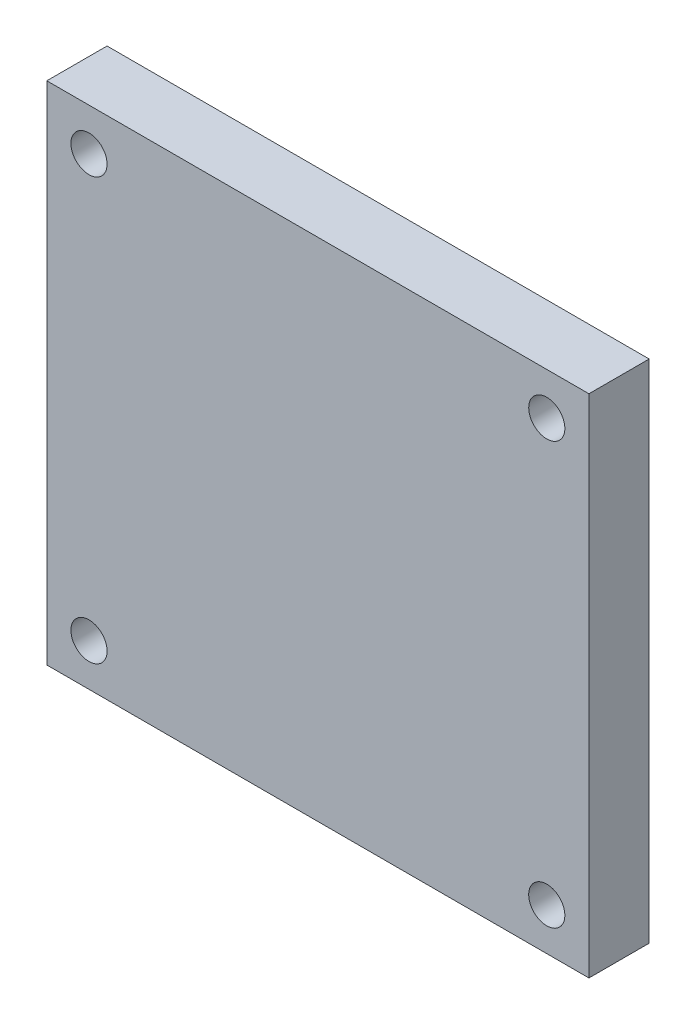
ISO-10303-21;
HEADER;
FILE_DESCRIPTION(('STEP AP214'),'2;1');
FILE_NAME('part.step','',(''),(''),'','','');
FILE_SCHEMA(('AUTOMOTIVE_DESIGN { 1 0 10303 214 1 1 1 1 }'));
ENDSEC;
DATA;
#1=APPLICATION_CONTEXT('core data for automotive mechanical design processes');
#2=APPLICATION_PROTOCOL_DEFINITION('international standard','automotive_design',2000,#1);
#3=PRODUCT_CONTEXT('',#1,'mechanical');
#4=PRODUCT('Part','Part','',(#3));
#5=PRODUCT_RELATED_PRODUCT_CATEGORY('part','',(#4));
#6=PRODUCT_DEFINITION_FORMATION('','',#4);
#7=PRODUCT_DEFINITION_CONTEXT('part definition',#1,'design');
#8=PRODUCT_DEFINITION('design','',#6,#7);
#9=PRODUCT_DEFINITION_SHAPE('','',#8);
#10=(LENGTH_UNIT() NAMED_UNIT(*) SI_UNIT(.MILLI.,.METRE.));
#11=(NAMED_UNIT(*) PLANE_ANGLE_UNIT() SI_UNIT($,.RADIAN.));
#12=(NAMED_UNIT(*) SI_UNIT($,.STERADIAN.) SOLID_ANGLE_UNIT());
#13=UNCERTAINTY_MEASURE_WITH_UNIT(LENGTH_MEASURE(1.E-05),#10,'distance_accuracy_value','');
#14=(GEOMETRIC_REPRESENTATION_CONTEXT(3) GLOBAL_UNCERTAINTY_ASSIGNED_CONTEXT((#13)) GLOBAL_UNIT_ASSIGNED_CONTEXT((#10,
#11,#12)) REPRESENTATION_CONTEXT('',''));
#15=CARTESIAN_POINT('',(0.,0.,0.));
#16=DIRECTION('',(0.,0.,1.));
#17=DIRECTION('',(1.,0.,0.));
#18=AXIS2_PLACEMENT_3D('',#15,#16,#17);
#19=CARTESIAN_POINT('',(0.,0.,5.));
#20=DIRECTION('',(0.,0.,1.));
#21=DIRECTION('',(1.,0.,0.));
#22=AXIS2_PLACEMENT_3D('',#19,#20,#21);
#23=PLANE('',#22);
#24=CARTESIAN_POINT('',(-3.5,38.5,5.));
#25=DIRECTION('',(0.,0.,1.));
#26=DIRECTION('',(-1.,0.,0.));
#27=AXIS2_PLACEMENT_3D('',#24,#25,#26);
#28=CIRCLE('',#27,1.5);
#29=CARTESIAN_POINT('',(-5.,38.5,5.));
#30=VERTEX_POINT('',#29);
#31=EDGE_CURVE('E146',#30,#30,#28,.T.);
#32=ORIENTED_EDGE('',*,*,#31,.F.);
#33=EDGE_LOOP('',(#32));
#34=FACE_BOUND('',#33,.T.);
#35=CARTESIAN_POINT('',(-3.5,3.5,5.));
#36=DIRECTION('',(0.,0.,1.));
#37=DIRECTION('',(1.,0.,0.));
#38=AXIS2_PLACEMENT_3D('',#35,#36,#37);
#39=CIRCLE('',#38,1.5);
#40=CARTESIAN_POINT('',(-2.,3.5,5.));
#41=VERTEX_POINT('',#40);
#42=EDGE_CURVE('E116',#41,#41,#39,.T.);
#43=ORIENTED_EDGE('',*,*,#42,.F.);
#44=EDGE_LOOP('',(#43));
#45=FACE_BOUND('',#44,.T.);
#46=DIRECTION('',(0.,1.,0.));
#47=VECTOR('',#46,1.);
#48=CARTESIAN_POINT('',(0.,0.,5.));
#49=LINE('',#48,#47);
#50=CARTESIAN_POINT('',(0.,0.,5.));
#51=VERTEX_POINT('',#50);
#52=CARTESIAN_POINT('',(0.,42.,5.));
#53=VERTEX_POINT('',#52);
#54=EDGE_CURVE('E96',#51,#53,#49,.T.);
#55=ORIENTED_EDGE('',*,*,#54,.T.);
#56=DIRECTION('',(-1.,0.,0.));
#57=VECTOR('',#56,1.);
#58=CARTESIAN_POINT('',(0.,42.,5.));
#59=LINE('',#58,#57);
#60=CARTESIAN_POINT('',(-45.,42.,5.));
#61=VERTEX_POINT('',#60);
#62=EDGE_CURVE('E91',#53,#61,#59,.T.);
#63=ORIENTED_EDGE('',*,*,#62,.T.);
#64=DIRECTION('',(0.,-1.,0.));
#65=VECTOR('',#64,1.);
#66=CARTESIAN_POINT('',(-45.,0.,5.));
#67=LINE('',#66,#65);
#68=CARTESIAN_POINT('',(-45.,0.,5.));
#69=VERTEX_POINT('',#68);
#70=EDGE_CURVE('E94',#61,#69,#67,.T.);
#71=ORIENTED_EDGE('',*,*,#70,.T.);
#72=DIRECTION('',(1.,0.,0.));
#73=VECTOR('',#72,1.);
#74=CARTESIAN_POINT('',(0.,0.,5.));
#75=LINE('',#74,#73);
#76=EDGE_CURVE('E61',#69,#51,#75,.T.);
#77=ORIENTED_EDGE('',*,*,#76,.T.);
#78=EDGE_LOOP('',(#55,#63,#71,#77));
#79=FACE_BOUND('',#78,.T.);
#80=CARTESIAN_POINT('',(-41.5,3.5,5.));
#81=DIRECTION('',(0.,0.,1.));
#82=DIRECTION('',(-1.,0.,0.));
#83=AXIS2_PLACEMENT_3D('',#80,#81,#82);
#84=CIRCLE('',#83,1.5);
#85=CARTESIAN_POINT('',(-43.,3.5,5.));
#86=VERTEX_POINT('',#85);
#87=EDGE_CURVE('E138',#86,#86,#84,.T.);
#88=ORIENTED_EDGE('',*,*,#87,.F.);
#89=EDGE_LOOP('',(#88));
#90=FACE_BOUND('',#89,.T.);
#91=CARTESIAN_POINT('',(-41.5,38.5,5.));
#92=DIRECTION('',(0.,0.,1.));
#93=DIRECTION('',(1.,0.,0.));
#94=AXIS2_PLACEMENT_3D('',#91,#92,#93);
#95=CIRCLE('',#94,1.5);
#96=CARTESIAN_POINT('',(-40.,38.5,5.));
#97=VERTEX_POINT('',#96);
#98=EDGE_CURVE('E154',#97,#97,#95,.T.);
#99=ORIENTED_EDGE('',*,*,#98,.F.);
#100=EDGE_LOOP('',(#99));
#101=FACE_BOUND('',#100,.T.);
#102=ADVANCED_FACE('F43',(#34,#45,#79,#90,#101),#23,.T.);
#103=CARTESIAN_POINT('',(0.,0.,0.));
#104=DIRECTION('',(0.,0.,1.));
#105=DIRECTION('',(1.,0.,0.));
#106=AXIS2_PLACEMENT_3D('',#103,#104,#105);
#107=PLANE('',#106);
#108=DIRECTION('',(0.,1.,0.));
#109=VECTOR('',#108,1.);
#110=CARTESIAN_POINT('',(0.,0.,0.));
#111=LINE('',#110,#109);
#112=CARTESIAN_POINT('',(0.,0.,0.));
#113=VERTEX_POINT('',#112);
#114=CARTESIAN_POINT('',(0.,42.,0.));
#115=VERTEX_POINT('',#114);
#116=EDGE_CURVE('E112',#113,#115,#111,.T.);
#117=ORIENTED_EDGE('',*,*,#116,.F.);
#118=DIRECTION('',(1.,0.,0.));
#119=VECTOR('',#118,1.);
#120=CARTESIAN_POINT('',(0.,0.,0.));
#121=LINE('',#120,#119);
#122=CARTESIAN_POINT('',(-45.,0.,0.));
#123=VERTEX_POINT('',#122);
#124=EDGE_CURVE('E84',#123,#113,#121,.T.);
#125=ORIENTED_EDGE('',*,*,#124,.F.);
#126=DIRECTION('',(0.,-1.,0.));
#127=VECTOR('',#126,1.);
#128=CARTESIAN_POINT('',(-45.,0.,0.));
#129=LINE('',#128,#127);
#130=CARTESIAN_POINT('',(-45.,42.,0.));
#131=VERTEX_POINT('',#130);
#132=EDGE_CURVE('E78',#131,#123,#129,.T.);
#133=ORIENTED_EDGE('',*,*,#132,.F.);
#134=DIRECTION('',(-1.,0.,0.));
#135=VECTOR('',#134,1.);
#136=CARTESIAN_POINT('',(0.,42.,0.));
#137=LINE('',#136,#135);
#138=EDGE_CURVE('E101',#115,#131,#137,.T.);
#139=ORIENTED_EDGE('',*,*,#138,.F.);
#140=EDGE_LOOP('',(#117,#125,#133,#139));
#141=FACE_BOUND('',#140,.T.);
#142=CARTESIAN_POINT('',(-3.5,3.5,0.));
#143=DIRECTION('',(0.,0.,1.));
#144=DIRECTION('',(1.,0.,0.));
#145=AXIS2_PLACEMENT_3D('',#142,#143,#144);
#146=CIRCLE('',#145,1.5);
#147=CARTESIAN_POINT('',(-2.,3.5,0.));
#148=VERTEX_POINT('',#147);
#149=EDGE_CURVE('E134',#148,#148,#146,.T.);
#150=ORIENTED_EDGE('',*,*,#149,.T.);
#151=EDGE_LOOP('',(#150));
#152=FACE_BOUND('',#151,.T.);
#153=CARTESIAN_POINT('',(-41.5,3.5,0.));
#154=DIRECTION('',(0.,0.,1.));
#155=DIRECTION('',(-1.,0.,0.));
#156=AXIS2_PLACEMENT_3D('',#153,#154,#155);
#157=CIRCLE('',#156,1.5);
#158=CARTESIAN_POINT('',(-43.,3.5,0.));
#159=VERTEX_POINT('',#158);
#160=EDGE_CURVE('E142',#159,#159,#157,.T.);
#161=ORIENTED_EDGE('',*,*,#160,.T.);
#162=EDGE_LOOP('',(#161));
#163=FACE_BOUND('',#162,.T.);
#164=CARTESIAN_POINT('',(-3.5,38.5,0.));
#165=DIRECTION('',(0.,0.,1.));
#166=DIRECTION('',(-1.,0.,0.));
#167=AXIS2_PLACEMENT_3D('',#164,#165,#166);
#168=CIRCLE('',#167,1.5);
#169=CARTESIAN_POINT('',(-5.,38.5,0.));
#170=VERTEX_POINT('',#169);
#171=EDGE_CURVE('E150',#170,#170,#168,.T.);
#172=ORIENTED_EDGE('',*,*,#171,.T.);
#173=EDGE_LOOP('',(#172));
#174=FACE_BOUND('',#173,.T.);
#175=CARTESIAN_POINT('',(-41.5,38.5,0.));
#176=DIRECTION('',(0.,0.,1.));
#177=DIRECTION('',(1.,0.,0.));
#178=AXIS2_PLACEMENT_3D('',#175,#176,#177);
#179=CIRCLE('',#178,1.5);
#180=CARTESIAN_POINT('',(-40.,38.5,0.));
#181=VERTEX_POINT('',#180);
#182=EDGE_CURVE('E158',#181,#181,#179,.T.);
#183=ORIENTED_EDGE('',*,*,#182,.T.);
#184=EDGE_LOOP('',(#183));
#185=FACE_BOUND('',#184,.T.);
#186=ADVANCED_FACE('F129',(#141,#152,#163,#174,#185),#107,.F.);
#187=CARTESIAN_POINT('',(0.,0.,5.));
#188=DIRECTION('',(-1.,0.,0.));
#189=DIRECTION('',(0.,0.,1.));
#190=AXIS2_PLACEMENT_3D('',#187,#188,#189);
#191=PLANE('',#190);
#192=ORIENTED_EDGE('',*,*,#116,.T.);
#193=DIRECTION('',(0.,0.,-1.));
#194=VECTOR('',#193,1.);
#195=CARTESIAN_POINT('',(0.,42.,5.));
#196=LINE('',#195,#194);
#197=EDGE_CURVE('E11',#53,#115,#196,.T.);
#198=ORIENTED_EDGE('',*,*,#197,.F.);
#199=ORIENTED_EDGE('',*,*,#54,.F.);
#200=DIRECTION('',(0.,0.,-1.));
#201=VECTOR('',#200,1.);
#202=CARTESIAN_POINT('',(0.,0.,5.));
#203=LINE('',#202,#201);
#204=EDGE_CURVE('E108',#51,#113,#203,.T.);
#205=ORIENTED_EDGE('',*,*,#204,.T.);
#206=EDGE_LOOP('',(#192,#198,#199,#205));
#207=FACE_BOUND('',#206,.T.);
#208=ADVANCED_FACE('F45',(#207),#191,.F.);
#209=CARTESIAN_POINT('',(0.,42.,5.));
#210=DIRECTION('',(0.,-1.,0.));
#211=DIRECTION('',(1.,0.,0.));
#212=AXIS2_PLACEMENT_3D('',#209,#210,#211);
#213=PLANE('',#212);
#214=ORIENTED_EDGE('',*,*,#138,.T.);
#215=DIRECTION('',(0.,0.,-1.));
#216=VECTOR('',#215,1.);
#217=CARTESIAN_POINT('',(-45.,42.,5.));
#218=LINE('',#217,#216);
#219=EDGE_CURVE('E53',#61,#131,#218,.T.);
#220=ORIENTED_EDGE('',*,*,#219,.F.);
#221=ORIENTED_EDGE('',*,*,#62,.F.);
#222=ORIENTED_EDGE('',*,*,#197,.T.);
#223=EDGE_LOOP('',(#214,#220,#221,#222));
#224=FACE_BOUND('',#223,.T.);
#225=ADVANCED_FACE('F100',(#224),#213,.F.);
#226=CARTESIAN_POINT('',(-45.,0.,5.));
#227=DIRECTION('',(1.,0.,0.));
#228=DIRECTION('',(0.,0.,-1.));
#229=AXIS2_PLACEMENT_3D('',#226,#227,#228);
#230=PLANE('',#229);
#231=ORIENTED_EDGE('',*,*,#132,.T.);
#232=DIRECTION('',(0.,0.,-1.));
#233=VECTOR('',#232,1.);
#234=CARTESIAN_POINT('',(-45.,0.,5.));
#235=LINE('',#234,#233);
#236=EDGE_CURVE('E103',#69,#123,#235,.T.);
#237=ORIENTED_EDGE('',*,*,#236,.F.);
#238=ORIENTED_EDGE('',*,*,#70,.F.);
#239=ORIENTED_EDGE('',*,*,#219,.T.);
#240=EDGE_LOOP('',(#231,#237,#238,#239));
#241=FACE_BOUND('',#240,.T.);
#242=ADVANCED_FACE('F104',(#241),#230,.F.);
#243=CARTESIAN_POINT('',(0.,0.,5.));
#244=DIRECTION('',(0.,1.,0.));
#245=DIRECTION('',(0.,0.,1.));
#246=AXIS2_PLACEMENT_3D('',#243,#244,#245);
#247=PLANE('',#246);
#248=ORIENTED_EDGE('',*,*,#124,.T.);
#249=ORIENTED_EDGE('',*,*,#204,.F.);
#250=ORIENTED_EDGE('',*,*,#76,.F.);
#251=ORIENTED_EDGE('',*,*,#236,.T.);
#252=EDGE_LOOP('',(#248,#249,#250,#251));
#253=FACE_BOUND('',#252,.T.);
#254=ADVANCED_FACE('F126',(#253),#247,.F.);
#255=CARTESIAN_POINT('',(-3.5,3.5,5.));
#256=DIRECTION('',(0.,0.,-1.));
#257=DIRECTION('',(-1.,0.,0.));
#258=AXIS2_PLACEMENT_3D('',#255,#256,#257);
#259=CYLINDRICAL_SURFACE('',#258,1.5);
#260=ORIENTED_EDGE('',*,*,#42,.T.);
#261=EDGE_LOOP('',(#260));
#262=FACE_BOUND('',#261,.T.);
#263=ORIENTED_EDGE('',*,*,#149,.F.);
#264=EDGE_LOOP('',(#263));
#265=FACE_BOUND('',#264,.T.);
#266=ADVANCED_FACE('F179',(#262,#265),#259,.F.);
#267=CARTESIAN_POINT('',(-41.5,3.5,5.));
#268=DIRECTION('',(0.,0.,-1.));
#269=DIRECTION('',(-1.,0.,0.));
#270=AXIS2_PLACEMENT_3D('',#267,#268,#269);
#271=CYLINDRICAL_SURFACE('',#270,1.5);
#272=ORIENTED_EDGE('',*,*,#87,.T.);
#273=EDGE_LOOP('',(#272));
#274=FACE_BOUND('',#273,.T.);
#275=ORIENTED_EDGE('',*,*,#160,.F.);
#276=EDGE_LOOP('',(#275));
#277=FACE_BOUND('',#276,.T.);
#278=ADVANCED_FACE('F233',(#274,#277),#271,.F.);
#279=CARTESIAN_POINT('',(-3.5,38.5,5.));
#280=DIRECTION('',(0.,0.,-1.));
#281=DIRECTION('',(-1.,0.,0.));
#282=AXIS2_PLACEMENT_3D('',#279,#280,#281);
#283=CYLINDRICAL_SURFACE('',#282,1.5);
#284=ORIENTED_EDGE('',*,*,#31,.T.);
#285=EDGE_LOOP('',(#284));
#286=FACE_BOUND('',#285,.T.);
#287=ORIENTED_EDGE('',*,*,#171,.F.);
#288=EDGE_LOOP('',(#287));
#289=FACE_BOUND('',#288,.T.);
#290=ADVANCED_FACE('F242',(#286,#289),#283,.F.);
#291=CARTESIAN_POINT('',(-41.5,38.5,5.));
#292=DIRECTION('',(0.,0.,-1.));
#293=DIRECTION('',(-1.,0.,0.));
#294=AXIS2_PLACEMENT_3D('',#291,#292,#293);
#295=CYLINDRICAL_SURFACE('',#294,1.5);
#296=ORIENTED_EDGE('',*,*,#98,.T.);
#297=EDGE_LOOP('',(#296));
#298=FACE_BOUND('',#297,.T.);
#299=ORIENTED_EDGE('',*,*,#182,.F.);
#300=EDGE_LOOP('',(#299));
#301=FACE_BOUND('',#300,.T.);
#302=ADVANCED_FACE('F166',(#298,#301),#295,.F.);
#303=CLOSED_SHELL('',(#102,#186,#208,#225,#242,#254,#266,#278,#290,#302));
#304=MANIFOLD_SOLID_BREP('B2',#303);
#305=ADVANCED_BREP_SHAPE_REPRESENTATION('',(#18,#304),#14);
#306=SHAPE_DEFINITION_REPRESENTATION(#9,#305);
ENDSEC;
END-ISO-10303-21;
